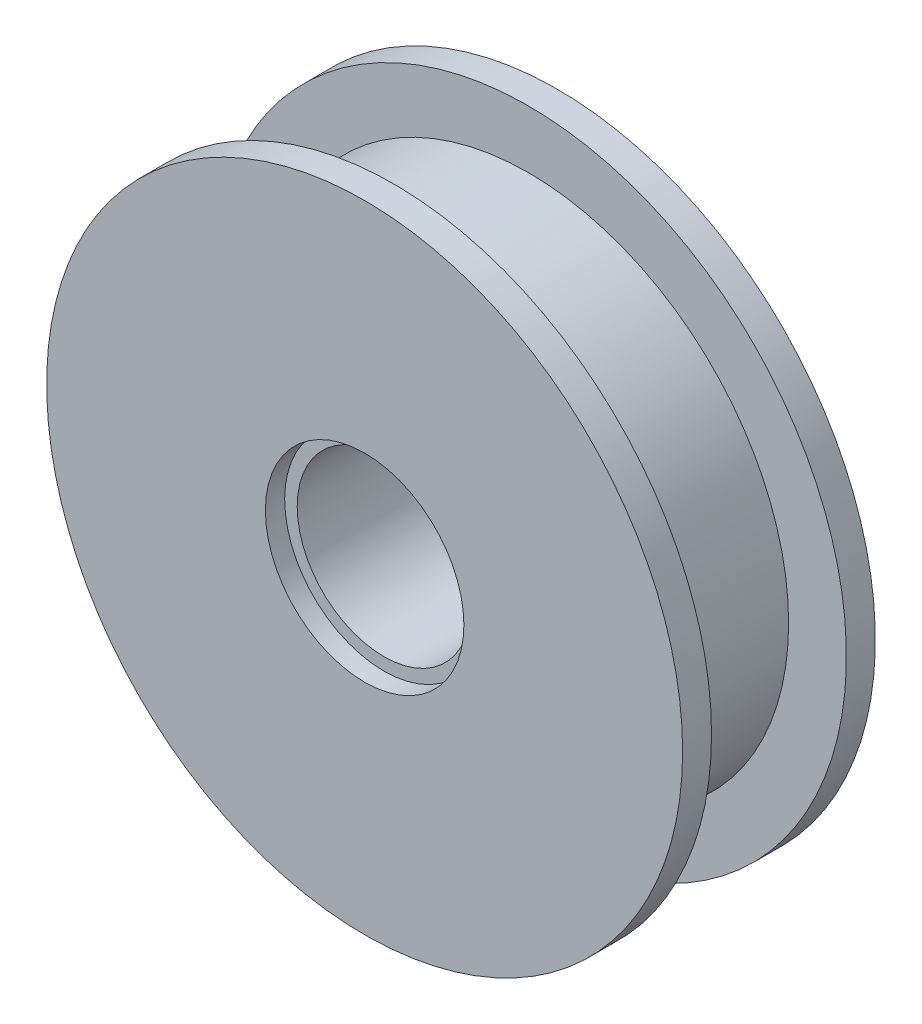
ISO-10303-21;
HEADER;
FILE_DESCRIPTION(('STEP AP214'),'2;1');
FILE_NAME('part.step','',(''),(''),'','','');
FILE_SCHEMA(('AUTOMOTIVE_DESIGN { 1 0 10303 214 1 1 1 1 }'));
ENDSEC;
DATA;
#1=APPLICATION_CONTEXT('core data for automotive mechanical design processes');
#2=APPLICATION_PROTOCOL_DEFINITION('international standard','automotive_design',2000,#1);
#3=PRODUCT_CONTEXT('',#1,'mechanical');
#4=PRODUCT('Part','Part','',(#3));
#5=PRODUCT_RELATED_PRODUCT_CATEGORY('part','',(#4));
#6=PRODUCT_DEFINITION_FORMATION('','',#4);
#7=PRODUCT_DEFINITION_CONTEXT('part definition',#1,'design');
#8=PRODUCT_DEFINITION('design','',#6,#7);
#9=PRODUCT_DEFINITION_SHAPE('','',#8);
#10=(LENGTH_UNIT() NAMED_UNIT(*) SI_UNIT(.MILLI.,.METRE.));
#11=(NAMED_UNIT(*) PLANE_ANGLE_UNIT() SI_UNIT($,.RADIAN.));
#12=(NAMED_UNIT(*) SI_UNIT($,.STERADIAN.) SOLID_ANGLE_UNIT());
#13=UNCERTAINTY_MEASURE_WITH_UNIT(LENGTH_MEASURE(1.E-05),#10,'distance_accuracy_value','');
#14=(GEOMETRIC_REPRESENTATION_CONTEXT(3) GLOBAL_UNCERTAINTY_ASSIGNED_CONTEXT((#13)) GLOBAL_UNIT_ASSIGNED_CONTEXT((#10,
#11,#12)) REPRESENTATION_CONTEXT('',''));
#15=CARTESIAN_POINT('',(0.,0.,0.));
#16=DIRECTION('',(0.,0.,1.));
#17=DIRECTION('',(1.,0.,0.));
#18=AXIS2_PLACEMENT_3D('',#15,#16,#17);
#19=CARTESIAN_POINT('',(0.,0.,10.));
#20=DIRECTION('',(0.,0.,-1.));
#21=DIRECTION('',(-1.,0.,0.));
#22=AXIS2_PLACEMENT_3D('',#19,#20,#21);
#23=CYLINDRICAL_SURFACE('',#22,13.5);
#24=CARTESIAN_POINT('',(0.,0.,1.5));
#25=DIRECTION('',(0.,0.,-1.));
#26=DIRECTION('',(-1.,0.,0.));
#27=AXIS2_PLACEMENT_3D('',#24,#25,#26);
#28=CIRCLE('',#27,13.5);
#29=CARTESIAN_POINT('',(-13.5,0.,1.5));
#30=VERTEX_POINT('',#29);
#31=EDGE_CURVE('E37',#30,#30,#28,.T.);
#32=ORIENTED_EDGE('',*,*,#31,.F.);
#33=EDGE_LOOP('',(#32));
#34=FACE_BOUND('',#33,.T.);
#35=CARTESIAN_POINT('',(0.,0.,8.5));
#36=DIRECTION('',(0.,0.,1.));
#37=DIRECTION('',(1.,0.,0.));
#38=AXIS2_PLACEMENT_3D('',#35,#36,#37);
#39=CIRCLE('',#38,13.5);
#40=CARTESIAN_POINT('',(13.5,0.,8.5));
#41=VERTEX_POINT('',#40);
#42=EDGE_CURVE('E10',#41,#41,#39,.T.);
#43=ORIENTED_EDGE('',*,*,#42,.F.);
#44=EDGE_LOOP('',(#43));
#45=FACE_BOUND('',#44,.T.);
#46=ADVANCED_FACE('F31',(#34,#45),#23,.T.);
#47=CARTESIAN_POINT('',(0.,0.,10.));
#48=DIRECTION('',(0.,0.,-1.));
#49=DIRECTION('',(-1.,0.,0.));
#50=AXIS2_PLACEMENT_3D('',#47,#48,#49);
#51=CYLINDRICAL_SURFACE('',#50,4.5);
#52=CARTESIAN_POINT('',(0.,0.,9.));
#53=DIRECTION('',(0.,0.,1.));
#54=DIRECTION('',(1.,0.,0.));
#55=AXIS2_PLACEMENT_3D('',#52,#53,#54);
#56=CIRCLE('',#55,4.5);
#57=CARTESIAN_POINT('',(4.5,0.,9.));
#58=VERTEX_POINT('',#57);
#59=EDGE_CURVE('E41',#58,#58,#56,.T.);
#60=ORIENTED_EDGE('',*,*,#59,.T.);
#61=EDGE_LOOP('',(#60));
#62=FACE_BOUND('',#61,.T.);
#63=CARTESIAN_POINT('',(0.,0.,0.999999999999999));
#64=DIRECTION('',(0.,0.,-1.));
#65=DIRECTION('',(-1.,0.,0.));
#66=AXIS2_PLACEMENT_3D('',#63,#64,#65);
#67=CIRCLE('',#66,4.5);
#68=CARTESIAN_POINT('',(-4.5,0.,0.999999999999999));
#69=VERTEX_POINT('',#68);
#70=EDGE_CURVE('E48',#69,#69,#67,.T.);
#71=ORIENTED_EDGE('',*,*,#70,.T.);
#72=EDGE_LOOP('',(#71));
#73=FACE_BOUND('',#72,.T.);
#74=ADVANCED_FACE('F87',(#62,#73),#51,.F.);
#75=CARTESIAN_POINT('',(0.,0.,10.));
#76=DIRECTION('',(0.,0.,1.));
#77=DIRECTION('',(1.,0.,0.));
#78=AXIS2_PLACEMENT_3D('',#75,#76,#77);
#79=PLANE('',#78);
#80=CARTESIAN_POINT('',(0.,0.,10.));
#81=DIRECTION('',(0.,0.,1.));
#82=DIRECTION('',(1.,0.,0.));
#83=AXIS2_PLACEMENT_3D('',#80,#81,#82);
#84=CIRCLE('',#83,5.15);
#85=CARTESIAN_POINT('',(5.15,0.,10.));
#86=VERTEX_POINT('',#85);
#87=EDGE_CURVE('E50',#86,#86,#84,.T.);
#88=ORIENTED_EDGE('',*,*,#87,.F.);
#89=EDGE_LOOP('',(#88));
#90=FACE_BOUND('',#89,.T.);
#91=CARTESIAN_POINT('',(0.,0.,10.));
#92=DIRECTION('',(0.,0.,1.));
#93=DIRECTION('',(1.,0.,0.));
#94=AXIS2_PLACEMENT_3D('',#91,#92,#93);
#95=CIRCLE('',#94,16.5);
#96=CARTESIAN_POINT('',(16.5,0.,10.));
#97=VERTEX_POINT('',#96);
#98=EDGE_CURVE('E69',#97,#97,#95,.T.);
#99=ORIENTED_EDGE('',*,*,#98,.T.);
#100=EDGE_LOOP('',(#99));
#101=FACE_BOUND('',#100,.T.);
#102=ADVANCED_FACE('F92',(#90,#101),#79,.T.);
#103=CARTESIAN_POINT('',(0.,0.,0.));
#104=DIRECTION('',(0.,0.,1.));
#105=DIRECTION('',(1.,0.,0.));
#106=AXIS2_PLACEMENT_3D('',#103,#104,#105);
#107=PLANE('',#106);
#108=CARTESIAN_POINT('',(0.,0.,0.));
#109=DIRECTION('',(0.,0.,-1.));
#110=DIRECTION('',(-1.,0.,0.));
#111=AXIS2_PLACEMENT_3D('',#108,#109,#110);
#112=CIRCLE('',#111,5.15);
#113=CARTESIAN_POINT('',(-5.15,0.,0.));
#114=VERTEX_POINT('',#113);
#115=EDGE_CURVE('E57',#114,#114,#112,.T.);
#116=ORIENTED_EDGE('',*,*,#115,.F.);
#117=EDGE_LOOP('',(#116));
#118=FACE_BOUND('',#117,.T.);
#119=CARTESIAN_POINT('',(0.,0.,0.));
#120=DIRECTION('',(0.,0.,-1.));
#121=DIRECTION('',(-1.,0.,0.));
#122=AXIS2_PLACEMENT_3D('',#119,#120,#121);
#123=CIRCLE('',#122,16.5);
#124=CARTESIAN_POINT('',(-16.5,0.,0.));
#125=VERTEX_POINT('',#124);
#126=EDGE_CURVE('E63',#125,#125,#123,.T.);
#127=ORIENTED_EDGE('',*,*,#126,.T.);
#128=EDGE_LOOP('',(#127));
#129=FACE_BOUND('',#128,.T.);
#130=ADVANCED_FACE('F99',(#118,#129),#107,.F.);
#131=CARTESIAN_POINT('',(0.,0.,9.));
#132=DIRECTION('',(0.,0.,1.));
#133=DIRECTION('',(1.,0.,0.));
#134=AXIS2_PLACEMENT_3D('',#131,#132,#133);
#135=CYLINDRICAL_SURFACE('',#134,5.15);
#136=CARTESIAN_POINT('',(0.,0.,9.));
#137=DIRECTION('',(0.,0.,1.));
#138=DIRECTION('',(1.,0.,0.));
#139=AXIS2_PLACEMENT_3D('',#136,#137,#138);
#140=CIRCLE('',#139,5.15);
#141=CARTESIAN_POINT('',(5.15,0.,9.));
#142=VERTEX_POINT('',#141);
#143=EDGE_CURVE('E45',#142,#142,#140,.T.);
#144=ORIENTED_EDGE('',*,*,#143,.F.);
#145=EDGE_LOOP('',(#144));
#146=FACE_BOUND('',#145,.T.);
#147=ORIENTED_EDGE('',*,*,#87,.T.);
#148=EDGE_LOOP('',(#147));
#149=FACE_BOUND('',#148,.T.);
#150=ADVANCED_FACE('F104',(#146,#149),#135,.F.);
#151=CARTESIAN_POINT('',(0.,0.,9.));
#152=DIRECTION('',(0.,0.,1.));
#153=DIRECTION('',(1.,0.,0.));
#154=AXIS2_PLACEMENT_3D('',#151,#152,#153);
#155=PLANE('',#154);
#156=ORIENTED_EDGE('',*,*,#59,.F.);
#157=EDGE_LOOP('',(#156));
#158=FACE_BOUND('',#157,.T.);
#159=ORIENTED_EDGE('',*,*,#143,.T.);
#160=EDGE_LOOP('',(#159));
#161=FACE_BOUND('',#160,.T.);
#162=ADVANCED_FACE('F111',(#158,#161),#155,.T.);
#163=CARTESIAN_POINT('',(0.,0.,1.));
#164=DIRECTION('',(0.,0.,-1.));
#165=DIRECTION('',(-1.,0.,0.));
#166=AXIS2_PLACEMENT_3D('',#163,#164,#165);
#167=CYLINDRICAL_SURFACE('',#166,5.15);
#168=CARTESIAN_POINT('',(0.,0.,1.));
#169=DIRECTION('',(0.,0.,-1.));
#170=DIRECTION('',(-1.,0.,0.));
#171=AXIS2_PLACEMENT_3D('',#168,#169,#170);
#172=CIRCLE('',#171,5.15);
#173=CARTESIAN_POINT('',(-5.15,0.,1.));
#174=VERTEX_POINT('',#173);
#175=EDGE_CURVE('E51',#174,#174,#172,.T.);
#176=ORIENTED_EDGE('',*,*,#175,.F.);
#177=EDGE_LOOP('',(#176));
#178=FACE_BOUND('',#177,.T.);
#179=ORIENTED_EDGE('',*,*,#115,.T.);
#180=EDGE_LOOP('',(#179));
#181=FACE_BOUND('',#180,.T.);
#182=ADVANCED_FACE('F127',(#178,#181),#167,.F.);
#183=CARTESIAN_POINT('',(0.,0.,1.));
#184=DIRECTION('',(0.,0.,-1.));
#185=DIRECTION('',(-1.,0.,0.));
#186=AXIS2_PLACEMENT_3D('',#183,#184,#185);
#187=PLANE('',#186);
#188=ORIENTED_EDGE('',*,*,#70,.F.);
#189=EDGE_LOOP('',(#188));
#190=FACE_BOUND('',#189,.T.);
#191=ORIENTED_EDGE('',*,*,#175,.T.);
#192=EDGE_LOOP('',(#191));
#193=FACE_BOUND('',#192,.T.);
#194=ADVANCED_FACE('F119',(#190,#193),#187,.T.);
#195=CARTESIAN_POINT('',(0.,0.,1.5));
#196=DIRECTION('',(0.,0.,-1.));
#197=DIRECTION('',(-1.,0.,0.));
#198=AXIS2_PLACEMENT_3D('',#195,#196,#197);
#199=CYLINDRICAL_SURFACE('',#198,16.5);
#200=CARTESIAN_POINT('',(0.,0.,1.5));
#201=DIRECTION('',(0.,0.,-1.));
#202=DIRECTION('',(-1.,0.,0.));
#203=AXIS2_PLACEMENT_3D('',#200,#201,#202);
#204=CIRCLE('',#203,16.5);
#205=CARTESIAN_POINT('',(-16.5,0.,1.5));
#206=VERTEX_POINT('',#205);
#207=EDGE_CURVE('E60',#206,#206,#204,.T.);
#208=ORIENTED_EDGE('',*,*,#207,.T.);
#209=EDGE_LOOP('',(#208));
#210=FACE_BOUND('',#209,.T.);
#211=ORIENTED_EDGE('',*,*,#126,.F.);
#212=EDGE_LOOP('',(#211));
#213=FACE_BOUND('',#212,.T.);
#214=ADVANCED_FACE('F117',(#210,#213),#199,.T.);
#215=CARTESIAN_POINT('',(0.,0.,1.5));
#216=DIRECTION('',(0.,0.,-1.));
#217=DIRECTION('',(-1.,0.,0.));
#218=AXIS2_PLACEMENT_3D('',#215,#216,#217);
#219=PLANE('',#218);
#220=ORIENTED_EDGE('',*,*,#31,.T.);
#221=EDGE_LOOP('',(#220));
#222=FACE_BOUND('',#221,.T.);
#223=ORIENTED_EDGE('',*,*,#207,.F.);
#224=EDGE_LOOP('',(#223));
#225=FACE_BOUND('',#224,.T.);
#226=ADVANCED_FACE('F84',(#222,#225),#219,.F.);
#227=CARTESIAN_POINT('',(0.,0.,8.5));
#228=DIRECTION('',(0.,0.,1.));
#229=DIRECTION('',(1.,0.,0.));
#230=AXIS2_PLACEMENT_3D('',#227,#228,#229);
#231=CYLINDRICAL_SURFACE('',#230,16.5);
#232=CARTESIAN_POINT('',(0.,0.,8.5));
#233=DIRECTION('',(0.,0.,1.));
#234=DIRECTION('',(1.,0.,0.));
#235=AXIS2_PLACEMENT_3D('',#232,#233,#234);
#236=CIRCLE('',#235,16.5);
#237=CARTESIAN_POINT('',(16.5,0.,8.5));
#238=VERTEX_POINT('',#237);
#239=EDGE_CURVE('E66',#238,#238,#236,.T.);
#240=ORIENTED_EDGE('',*,*,#239,.T.);
#241=EDGE_LOOP('',(#240));
#242=FACE_BOUND('',#241,.T.);
#243=ORIENTED_EDGE('',*,*,#98,.F.);
#244=EDGE_LOOP('',(#243));
#245=FACE_BOUND('',#244,.T.);
#246=ADVANCED_FACE('F75',(#242,#245),#231,.T.);
#247=CARTESIAN_POINT('',(0.,0.,8.5));
#248=DIRECTION('',(0.,0.,1.));
#249=DIRECTION('',(1.,0.,0.));
#250=AXIS2_PLACEMENT_3D('',#247,#248,#249);
#251=PLANE('',#250);
#252=ORIENTED_EDGE('',*,*,#42,.T.);
#253=EDGE_LOOP('',(#252));
#254=FACE_BOUND('',#253,.T.);
#255=ORIENTED_EDGE('',*,*,#239,.F.);
#256=EDGE_LOOP('',(#255));
#257=FACE_BOUND('',#256,.T.);
#258=ADVANCED_FACE('F78',(#254,#257),#251,.F.);
#259=CLOSED_SHELL('',(#46,#74,#102,#130,#150,#162,#182,#194,#214,#226,#246,#258));
#260=MANIFOLD_SOLID_BREP('B2',#259);
#261=ADVANCED_BREP_SHAPE_REPRESENTATION('',(#18,#260),#14);
#262=SHAPE_DEFINITION_REPRESENTATION(#9,#261);
ENDSEC;
END-ISO-10303-21;
